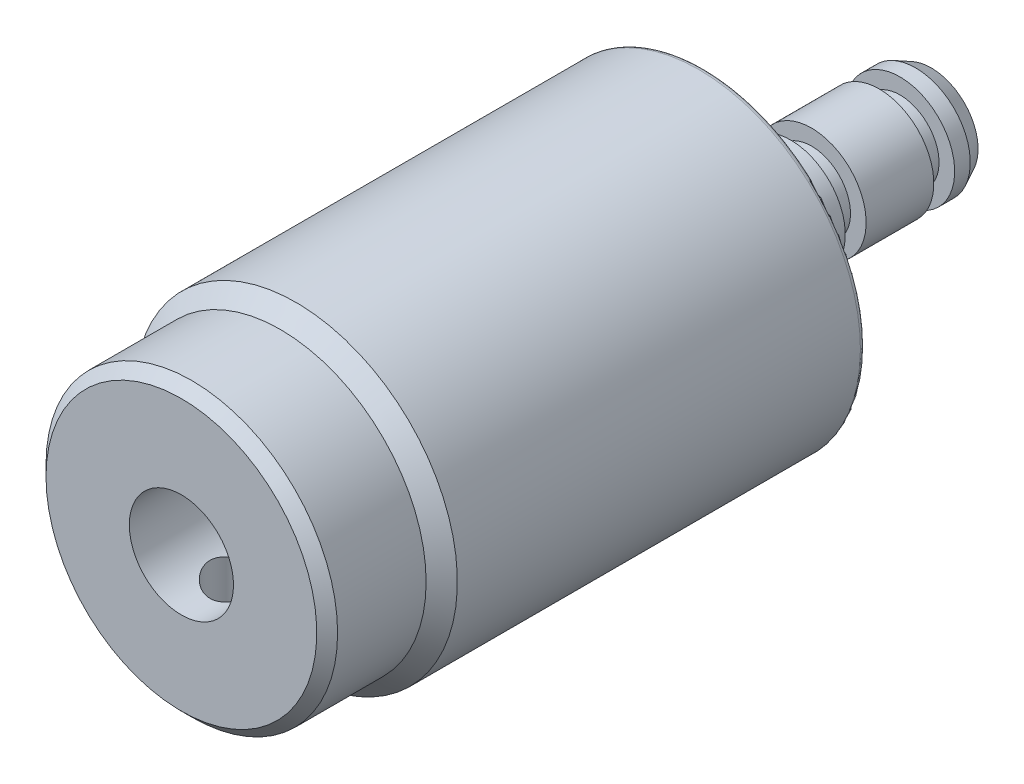
ISO-10303-21;
HEADER;
FILE_DESCRIPTION(('STEP AP214'),'2;1');
FILE_NAME('part.step','',(''),(''),'','','');
FILE_SCHEMA(('AUTOMOTIVE_DESIGN { 1 0 10303 214 1 1 1 1 }'));
ENDSEC;
DATA;
#1=APPLICATION_CONTEXT('core data for automotive mechanical design processes');
#2=APPLICATION_PROTOCOL_DEFINITION('international standard','automotive_design',2000,#1);
#3=PRODUCT_CONTEXT('',#1,'mechanical');
#4=PRODUCT('Part','Part','',(#3));
#5=PRODUCT_RELATED_PRODUCT_CATEGORY('part','',(#4));
#6=PRODUCT_DEFINITION_FORMATION('','',#4);
#7=PRODUCT_DEFINITION_CONTEXT('part definition',#1,'design');
#8=PRODUCT_DEFINITION('design','',#6,#7);
#9=PRODUCT_DEFINITION_SHAPE('','',#8);
#10=(LENGTH_UNIT() NAMED_UNIT(*) SI_UNIT(.MILLI.,.METRE.));
#11=(NAMED_UNIT(*) PLANE_ANGLE_UNIT() SI_UNIT($,.RADIAN.));
#12=(NAMED_UNIT(*) SI_UNIT($,.STERADIAN.) SOLID_ANGLE_UNIT());
#13=UNCERTAINTY_MEASURE_WITH_UNIT(LENGTH_MEASURE(1.E-05),#10,'distance_accuracy_value','');
#14=(GEOMETRIC_REPRESENTATION_CONTEXT(3) GLOBAL_UNCERTAINTY_ASSIGNED_CONTEXT((#13)) GLOBAL_UNIT_ASSIGNED_CONTEXT((#10,
#11,#12)) REPRESENTATION_CONTEXT('',''));
#15=CARTESIAN_POINT('',(0.,0.,0.));
#16=DIRECTION('',(0.,0.,1.));
#17=DIRECTION('',(1.,0.,0.));
#18=AXIS2_PLACEMENT_3D('',#15,#16,#17);
#19=CARTESIAN_POINT('',(0.,0.,0.));
#20=DIRECTION('',(0.,0.,-1.));
#21=DIRECTION('',(-1.,0.,0.));
#22=AXIS2_PLACEMENT_3D('',#19,#20,#21);
#23=CYLINDRICAL_SURFACE('',#22,2.62499999999998);
#24=CARTESIAN_POINT('',(0.,0.,6.75));
#25=DIRECTION('',(0.,0.,-1.));
#26=DIRECTION('',(-1.,0.,0.));
#27=AXIS2_PLACEMENT_3D('',#24,#25,#26);
#28=CIRCLE('',#27,2.62499999999998);
#29=CARTESIAN_POINT('',(-2.62499999999998,0.,6.75));
#30=VERTEX_POINT('',#29);
#31=EDGE_CURVE('E68',#30,#30,#28,.T.);
#32=ORIENTED_EDGE('',*,*,#31,.F.);
#33=EDGE_LOOP('',(#32));
#34=FACE_BOUND('',#33,.T.);
#35=CARTESIAN_POINT('',(0.,0.,7.75));
#36=DIRECTION('',(0.,0.,-1.));
#37=DIRECTION('',(-1.,0.,0.));
#38=AXIS2_PLACEMENT_3D('',#35,#36,#37);
#39=CIRCLE('',#38,2.62499999999998);
#40=CARTESIAN_POINT('',(-2.62499999999998,0.,7.75));
#41=VERTEX_POINT('',#40);
#42=EDGE_CURVE('E136',#41,#41,#39,.T.);
#43=ORIENTED_EDGE('',*,*,#42,.T.);
#44=EDGE_LOOP('',(#43));
#45=FACE_BOUND('',#44,.T.);
#46=ADVANCED_FACE('F43',(#34,#45),#23,.T.);
#47=CARTESIAN_POINT('',(2.62499999999998,0.,6.75));
#48=DIRECTION('',(0.,0.,1.));
#49=DIRECTION('',(1.,0.,0.));
#50=AXIS2_PLACEMENT_3D('',#47,#48,#49);
#51=PLANE('',#50);
#52=CARTESIAN_POINT('',(0.,0.,6.75));
#53=DIRECTION('',(0.,0.,-1.));
#54=DIRECTION('',(-1.,0.,0.));
#55=AXIS2_PLACEMENT_3D('',#52,#53,#54);
#56=CIRCLE('',#55,1.875);
#57=CARTESIAN_POINT('',(-1.875,0.,6.75));
#58=VERTEX_POINT('',#57);
#59=EDGE_CURVE('E72',#58,#58,#56,.T.);
#60=ORIENTED_EDGE('',*,*,#59,.F.);
#61=EDGE_LOOP('',(#60));
#62=FACE_BOUND('',#61,.T.);
#63=ORIENTED_EDGE('',*,*,#31,.T.);
#64=EDGE_LOOP('',(#63));
#65=FACE_BOUND('',#64,.T.);
#66=ADVANCED_FACE('F188',(#62,#65),#51,.F.);
#67=CARTESIAN_POINT('',(0.,0.,0.));
#68=DIRECTION('',(0.,0.,-1.));
#69=DIRECTION('',(-1.,0.,0.));
#70=AXIS2_PLACEMENT_3D('',#67,#68,#69);
#71=CYLINDRICAL_SURFACE('',#70,1.875);
#72=CARTESIAN_POINT('',(0.,0.,5.75));
#73=DIRECTION('',(0.,0.,-1.));
#74=DIRECTION('',(-1.,0.,0.));
#75=AXIS2_PLACEMENT_3D('',#72,#73,#74);
#76=CIRCLE('',#75,1.875);
#77=CARTESIAN_POINT('',(-1.875,0.,5.75));
#78=VERTEX_POINT('',#77);
#79=EDGE_CURVE('E76',#78,#78,#76,.T.);
#80=ORIENTED_EDGE('',*,*,#79,.F.);
#81=EDGE_LOOP('',(#80));
#82=FACE_BOUND('',#81,.T.);
#83=ORIENTED_EDGE('',*,*,#59,.T.);
#84=EDGE_LOOP('',(#83));
#85=FACE_BOUND('',#84,.T.);
#86=ADVANCED_FACE('F194',(#82,#85),#71,.T.);
#87=CARTESIAN_POINT('',(1.875,0.,5.75));
#88=DIRECTION('',(0.,0.,-1.));
#89=DIRECTION('',(-1.,0.,0.));
#90=AXIS2_PLACEMENT_3D('',#87,#88,#89);
#91=PLANE('',#90);
#92=CARTESIAN_POINT('',(0.,0.,5.75));
#93=DIRECTION('',(0.,0.,-1.));
#94=DIRECTION('',(-1.,0.,0.));
#95=AXIS2_PLACEMENT_3D('',#92,#93,#94);
#96=CIRCLE('',#95,2.625);
#97=CARTESIAN_POINT('',(-2.625,0.,5.75));
#98=VERTEX_POINT('',#97);
#99=EDGE_CURVE('E80',#98,#98,#96,.T.);
#100=ORIENTED_EDGE('',*,*,#99,.F.);
#101=EDGE_LOOP('',(#100));
#102=FACE_BOUND('',#101,.T.);
#103=ORIENTED_EDGE('',*,*,#79,.T.);
#104=EDGE_LOOP('',(#103));
#105=FACE_BOUND('',#104,.T.);
#106=ADVANCED_FACE('F312',(#102,#105),#91,.F.);
#107=CARTESIAN_POINT('',(0.,0.,0.));
#108=DIRECTION('',(0.,0.,-1.));
#109=DIRECTION('',(-1.,0.,0.));
#110=AXIS2_PLACEMENT_3D('',#107,#108,#109);
#111=CYLINDRICAL_SURFACE('',#110,2.625);
#112=CARTESIAN_POINT('',(0.,0.,2.5));
#113=DIRECTION('',(0.,0.,-1.));
#114=DIRECTION('',(-1.,0.,0.));
#115=AXIS2_PLACEMENT_3D('',#112,#113,#114);
#116=CIRCLE('',#115,2.625);
#117=CARTESIAN_POINT('',(-2.625,0.,2.5));
#118=VERTEX_POINT('',#117);
#119=EDGE_CURVE('E84',#118,#118,#116,.T.);
#120=ORIENTED_EDGE('',*,*,#119,.F.);
#121=EDGE_LOOP('',(#120));
#122=FACE_BOUND('',#121,.T.);
#123=ORIENTED_EDGE('',*,*,#99,.T.);
#124=EDGE_LOOP('',(#123));
#125=FACE_BOUND('',#124,.T.);
#126=ADVANCED_FACE('F304',(#122,#125),#111,.T.);
#127=CARTESIAN_POINT('',(2.625,0.,2.5));
#128=DIRECTION('',(0.,0.,1.));
#129=DIRECTION('',(1.,0.,0.));
#130=AXIS2_PLACEMENT_3D('',#127,#128,#129);
#131=PLANE('',#130);
#132=CARTESIAN_POINT('',(0.,0.,2.5));
#133=DIRECTION('',(0.,0.,-1.));
#134=DIRECTION('',(-1.,0.,0.));
#135=AXIS2_PLACEMENT_3D('',#132,#133,#134);
#136=CIRCLE('',#135,1.875);
#137=CARTESIAN_POINT('',(-1.875,0.,2.5));
#138=VERTEX_POINT('',#137);
#139=EDGE_CURVE('E88',#138,#138,#136,.T.);
#140=ORIENTED_EDGE('',*,*,#139,.F.);
#141=EDGE_LOOP('',(#140));
#142=FACE_BOUND('',#141,.T.);
#143=ORIENTED_EDGE('',*,*,#119,.T.);
#144=EDGE_LOOP('',(#143));
#145=FACE_BOUND('',#144,.T.);
#146=ADVANCED_FACE('F296',(#142,#145),#131,.F.);
#147=CARTESIAN_POINT('',(0.,0.,0.));
#148=DIRECTION('',(0.,0.,-1.));
#149=DIRECTION('',(-1.,0.,0.));
#150=AXIS2_PLACEMENT_3D('',#147,#148,#149);
#151=CYLINDRICAL_SURFACE('',#150,1.875);
#152=CARTESIAN_POINT('',(0.,0.,1.5));
#153=DIRECTION('',(0.,0.,-1.));
#154=DIRECTION('',(-1.,0.,0.));
#155=AXIS2_PLACEMENT_3D('',#152,#153,#154);
#156=CIRCLE('',#155,1.875);
#157=CARTESIAN_POINT('',(-1.875,0.,1.5));
#158=VERTEX_POINT('',#157);
#159=EDGE_CURVE('E92',#158,#158,#156,.T.);
#160=ORIENTED_EDGE('',*,*,#159,.F.);
#161=EDGE_LOOP('',(#160));
#162=FACE_BOUND('',#161,.T.);
#163=ORIENTED_EDGE('',*,*,#139,.T.);
#164=EDGE_LOOP('',(#163));
#165=FACE_BOUND('',#164,.T.);
#166=ADVANCED_FACE('F288',(#162,#165),#151,.T.);
#167=CARTESIAN_POINT('',(1.875,0.,1.5));
#168=DIRECTION('',(0.,0.,-1.));
#169=DIRECTION('',(-1.,0.,0.));
#170=AXIS2_PLACEMENT_3D('',#167,#168,#169);
#171=PLANE('',#170);
#172=CARTESIAN_POINT('',(0.,0.,1.5));
#173=DIRECTION('',(0.,0.,-1.));
#174=DIRECTION('',(-1.,0.,0.));
#175=AXIS2_PLACEMENT_3D('',#172,#173,#174);
#176=CIRCLE('',#175,2.625);
#177=CARTESIAN_POINT('',(-2.625,0.,1.5));
#178=VERTEX_POINT('',#177);
#179=EDGE_CURVE('E96',#178,#178,#176,.T.);
#180=ORIENTED_EDGE('',*,*,#179,.F.);
#181=EDGE_LOOP('',(#180));
#182=FACE_BOUND('',#181,.T.);
#183=ORIENTED_EDGE('',*,*,#159,.T.);
#184=EDGE_LOOP('',(#183));
#185=FACE_BOUND('',#184,.T.);
#186=ADVANCED_FACE('F280',(#182,#185),#171,.F.);
#187=CARTESIAN_POINT('',(0.,0.,0.));
#188=DIRECTION('',(0.,0.,-1.));
#189=DIRECTION('',(-1.,0.,0.));
#190=AXIS2_PLACEMENT_3D('',#187,#188,#189);
#191=CYLINDRICAL_SURFACE('',#190,2.625);
#192=CARTESIAN_POINT('',(0.,0.,0.75));
#193=DIRECTION('',(0.,0.,-1.));
#194=DIRECTION('',(-1.,0.,0.));
#195=AXIS2_PLACEMENT_3D('',#192,#193,#194);
#196=CIRCLE('',#195,2.625);
#197=CARTESIAN_POINT('',(-2.625,0.,0.75));
#198=VERTEX_POINT('',#197);
#199=EDGE_CURVE('E100',#198,#198,#196,.T.);
#200=ORIENTED_EDGE('',*,*,#199,.F.);
#201=EDGE_LOOP('',(#200));
#202=FACE_BOUND('',#201,.T.);
#203=ORIENTED_EDGE('',*,*,#179,.T.);
#204=EDGE_LOOP('',(#203));
#205=FACE_BOUND('',#204,.T.);
#206=ADVANCED_FACE('F272',(#202,#205),#191,.T.);
#207=CARTESIAN_POINT('',(0.,0.,0.75));
#208=DIRECTION('',(0.,0.,1.));
#209=DIRECTION('',(1.,0.,0.));
#210=AXIS2_PLACEMENT_3D('',#207,#208,#209);
#211=CONICAL_SURFACE('',#210,2.625,0.463647609000807);
#212=CARTESIAN_POINT('',(0.,0.,0.));
#213=DIRECTION('',(0.,0.,-1.));
#214=DIRECTION('',(-1.,0.,0.));
#215=AXIS2_PLACEMENT_3D('',#212,#213,#214);
#216=CIRCLE('',#215,2.25);
#217=CARTESIAN_POINT('',(-2.25,0.,0.));
#218=VERTEX_POINT('',#217);
#219=EDGE_CURVE('E104',#218,#218,#216,.T.);
#220=ORIENTED_EDGE('',*,*,#219,.F.);
#221=EDGE_LOOP('',(#220));
#222=FACE_BOUND('',#221,.T.);
#223=ORIENTED_EDGE('',*,*,#199,.T.);
#224=EDGE_LOOP('',(#223));
#225=FACE_BOUND('',#224,.T.);
#226=ADVANCED_FACE('F264',(#222,#225),#211,.T.);
#227=CARTESIAN_POINT('',(2.25,0.,0.));
#228=DIRECTION('',(0.,0.,1.));
#229=DIRECTION('',(1.,0.,0.));
#230=AXIS2_PLACEMENT_3D('',#227,#228,#229);
#231=PLANE('',#230);
#232=CARTESIAN_POINT('',(0.,0.,0.));
#233=DIRECTION('',(0.,0.,-1.));
#234=DIRECTION('',(-1.,0.,0.));
#235=AXIS2_PLACEMENT_3D('',#232,#233,#234);
#236=CIRCLE('',#235,1.5);
#237=CARTESIAN_POINT('',(-1.5,0.,0.));
#238=VERTEX_POINT('',#237);
#239=EDGE_CURVE('E108',#238,#238,#236,.T.);
#240=ORIENTED_EDGE('',*,*,#239,.F.);
#241=EDGE_LOOP('',(#240));
#242=FACE_BOUND('',#241,.T.);
#243=ORIENTED_EDGE('',*,*,#219,.T.);
#244=EDGE_LOOP('',(#243));
#245=FACE_BOUND('',#244,.T.);
#246=ADVANCED_FACE('F256',(#242,#245),#231,.F.);
#247=CARTESIAN_POINT('',(0.,0.,0.));
#248=DIRECTION('',(0.,0.,-1.));
#249=DIRECTION('',(-1.,0.,0.));
#250=AXIS2_PLACEMENT_3D('',#247,#248,#249);
#251=CYLINDRICAL_SURFACE('',#250,1.50000000000001);
#252=CARTESIAN_POINT('',(0.,0.,30.4226497308104));
#253=DIRECTION('',(0.,0.,-1.));
#254=DIRECTION('',(-1.,0.,0.));
#255=AXIS2_PLACEMENT_3D('',#252,#253,#254);
#256=CIRCLE('',#255,1.50000000000002);
#257=CARTESIAN_POINT('',(-1.50000000000001,0.,30.4226497308104));
#258=VERTEX_POINT('',#257);
#259=EDGE_CURVE('E112',#258,#258,#256,.T.);
#260=ORIENTED_EDGE('',*,*,#259,.F.);
#261=EDGE_LOOP('',(#260));
#262=FACE_BOUND('',#261,.T.);
#263=ORIENTED_EDGE('',*,*,#239,.T.);
#264=EDGE_LOOP('',(#263));
#265=FACE_BOUND('',#264,.T.);
#266=ADVANCED_FACE('F248',(#262,#265),#251,.F.);
#267=CARTESIAN_POINT('',(0.,0.,30.4226497308104));
#268=DIRECTION('',(0.,0.,1.));
#269=DIRECTION('',(1.,0.,0.));
#270=AXIS2_PLACEMENT_3D('',#267,#268,#269);
#271=CONICAL_SURFACE('',#270,1.50000000000002,1.0471975511966);
#272=CARTESIAN_POINT('',(0.,0.,31.));
#273=DIRECTION('',(0.,0.,-1.));
#274=DIRECTION('',(-1.,0.,0.));
#275=AXIS2_PLACEMENT_3D('',#272,#273,#274);
#276=CIRCLE('',#275,2.5);
#277=CARTESIAN_POINT('',(-2.49999999999999,0.,31.));
#278=VERTEX_POINT('',#277);
#279=EDGE_CURVE('E116',#278,#278,#276,.T.);
#280=ORIENTED_EDGE('',*,*,#279,.F.);
#281=EDGE_LOOP('',(#280));
#282=FACE_BOUND('',#281,.T.);
#283=ORIENTED_EDGE('',*,*,#259,.T.);
#284=EDGE_LOOP('',(#283));
#285=FACE_BOUND('',#284,.T.);
#286=ADVANCED_FACE('F240',(#282,#285),#271,.F.);
#287=CARTESIAN_POINT('',(0.,0.,0.));
#288=DIRECTION('',(0.,0.,-1.));
#289=DIRECTION('',(-1.,0.,0.));
#290=AXIS2_PLACEMENT_3D('',#287,#288,#289);
#291=CYLINDRICAL_SURFACE('',#290,2.5);
#292=CARTESIAN_POINT('',(0.,-2.5,32.125));
#293=CARTESIAN_POINT('',(0.0657149536912367,-2.49999641755188,32.1250041278994));
#294=CARTESIAN_POINT('',(0.131508249622544,-2.49738113774397,32.1302125914021));
#295=CARTESIAN_POINT('',(0.261150294085534,-2.48717695046745,32.1508161004261));
#296=CARTESIAN_POINT('',(0.324995108391882,-2.47957859786229,32.1662304912471));
#297=CARTESIAN_POINT('',(0.448666931100718,-2.46020349254139,32.206492260771));
#298=CARTESIAN_POINT('',(0.508508503673972,-2.448442989719,32.23130298031));
#299=CARTESIAN_POINT('',(0.623090771008202,-2.42182220644723,32.2894632767062));
#300=CARTESIAN_POINT('',(0.677831867487559,-2.40696217041913,32.3228121803111));
#301=CARTESIAN_POINT('',(0.784384772202398,-2.37445322822571,32.3993965618566));
#302=CARTESIAN_POINT('',(0.83581901390264,-2.3566899890942,32.4431080990495));
#303=CARTESIAN_POINT('',(0.930974306083721,-2.3207496280843,32.5381518490588));
#304=CARTESIAN_POINT('',(0.974689478883456,-2.30257220261294,32.5894898147155));
#305=CARTESIAN_POINT('',(1.05656500056285,-2.26623688996684,32.7031041869042));
#306=CARTESIAN_POINT('',(1.09403166943954,-2.24818983712665,32.7659201229324));
#307=CARTESIAN_POINT('',(1.15771028361337,-2.21607473465401,32.8979591699828));
#308=CARTESIAN_POINT('',(1.18393026870792,-2.20200384508737,32.9671776609034));
#309=CARTESIAN_POINT('',(1.22266555273573,-2.18072333797261,33.1058313817774));
#310=CARTESIAN_POINT('',(1.23590732135055,-2.17315339479642,33.1750055650842));
#311=CARTESIAN_POINT('',(1.25053374163605,-2.1647736243566,33.3149735472243));
#312=CARTESIAN_POINT('',(1.25193011046634,-2.1639571167911,33.3857656760889));
#313=CARTESIAN_POINT('',(1.24335910896536,-2.16888662821561,33.5178575303942));
#314=CARTESIAN_POINT('',(1.23473069942102,-2.17385954577517,33.5792800390288));
#315=CARTESIAN_POINT('',(1.20867481132116,-2.18845285917313,33.6996523867163));
#316=CARTESIAN_POINT('',(1.19124452987206,-2.1980747353972,33.7586014316316));
#317=CARTESIAN_POINT('',(1.1477622254825,-2.22109345515926,33.8740364157071));
#318=CARTESIAN_POINT('',(1.12151883389499,-2.23457300829998,33.9304329984822));
#319=CARTESIAN_POINT('',(1.061302109585,-2.26379255351755,34.0382928657375));
#320=CARTESIAN_POINT('',(1.02732530476558,-2.27953355975238,34.0897539195001));
#321=CARTESIAN_POINT('',(0.947582568640982,-2.31391447379107,34.193151565929));
#322=CARTESIAN_POINT('',(0.900868072961599,-2.33266887795933,34.2443210919702));
#323=CARTESIAN_POINT('',(0.799444473426716,-2.36934529125509,34.3384192732386));
#324=CARTESIAN_POINT('',(0.744731570717857,-2.38726689948501,34.3813439900423));
#325=CARTESIAN_POINT('',(0.625645632289814,-2.42127484103705,34.4596070762871));
#326=CARTESIAN_POINT('',(0.560941989499266,-2.43723730202509,34.4945005905572));
#327=CARTESIAN_POINT('',(0.425582769361,-2.46447351401553,34.5526212863037));
#328=CARTESIAN_POINT('',(0.354931970331598,-2.47575098679441,34.5758577312689));
#329=CARTESIAN_POINT('',(0.215958114575878,-2.49155417176795,34.6080942546458));
#330=CARTESIAN_POINT('',(0.147926913185406,-2.49656172876639,34.6181140446835));
#331=CARTESIAN_POINT('',(0.0109744999366943,-2.50091266823877,34.6268309139181));
#332=CARTESIAN_POINT('',(-0.0579462748373739,-2.5002587340164,34.6255333570493));
#333=CARTESIAN_POINT('',(-0.189041214982488,-2.49363990316801,34.6122416394765));
#334=CARTESIAN_POINT('',(-0.251324260062439,-2.48809057110237,34.6010843340874));
#335=CARTESIAN_POINT('',(-0.373008615377391,-2.47277714143524,34.5697024101311));
#336=CARTESIAN_POINT('',(-0.432409607113741,-2.46301257917915,34.5494767919333));
#337=CARTESIAN_POINT('',(-0.548610760562077,-2.43980314267087,34.5000019169585));
#338=CARTESIAN_POINT('',(-0.605287996257687,-2.42626102212424,34.470511187354));
#339=CARTESIAN_POINT('',(-0.713076702123645,-2.39679967896386,34.4036155804424));
#340=CARTESIAN_POINT('',(-0.764185787219097,-2.38087944457231,34.3662073317582));
#341=CARTESIAN_POINT('',(-0.864709611613312,-2.3463527667183,34.2802994683339));
#342=CARTESIAN_POINT('',(-0.913465097280794,-2.32763606060551,34.231071414433));
#343=CARTESIAN_POINT('',(-1.00232040139154,-2.29077989504843,34.1250935609133));
#344=CARTESIAN_POINT('',(-1.04241423211354,-2.27264084226908,34.0683386014795));
#345=CARTESIAN_POINT('',(-1.11463489312211,-2.23813990282585,33.9454454322496));
#346=CARTESIAN_POINT('',(-1.14628186984829,-2.2219066207934,33.8789859172392));
#347=CARTESIAN_POINT('',(-1.19760353251724,-2.19467590460158,33.7406124153843));
#348=CARTESIAN_POINT('',(-1.21729364485945,-2.18367172800773,33.6687055918735));
#349=CARTESIAN_POINT('',(-1.24232710931209,-2.16951876260834,33.5288622214232));
#350=CARTESIAN_POINT('',(-1.24886624550107,-2.16571729325614,33.4612071832137));
#351=CARTESIAN_POINT('',(-1.25086144297597,-2.16456693307719,33.3256911660366));
#352=CARTESIAN_POINT('',(-1.24632230828049,-2.16721524534441,33.2578302890757));
#353=CARTESIAN_POINT('',(-1.22740765699032,-2.17797327562531,33.130645623085));
#354=CARTESIAN_POINT('',(-1.21401039292849,-2.18553868102992,33.0711244123195));
#355=CARTESIAN_POINT('',(-1.17896919778079,-2.20463770234897,32.9552398507191));
#356=CARTESIAN_POINT('',(-1.15732261394975,-2.21617259462095,32.898877522385));
#357=CARTESIAN_POINT('',(-1.10476968162584,-2.2428566295566,32.7867189362667));
#358=CARTESIAN_POINT('',(-1.07333892227056,-2.25819652995239,32.7312151227129));
#359=CARTESIAN_POINT('',(-1.00268871454578,-2.29044164543238,32.6259068297743));
#360=CARTESIAN_POINT('',(-0.963465214048296,-2.30734767243153,32.5761053368519));
#361=CARTESIAN_POINT('',(-0.872754158330787,-2.34327903949141,32.477322522053));
#362=CARTESIAN_POINT('',(-0.820355528762701,-2.36231229139336,32.4291761220476));
#363=CARTESIAN_POINT('',(-0.707693507775337,-2.3984719031886,32.3421712707204));
#364=CARTESIAN_POINT('',(-0.647425904070968,-2.4155972326005,32.3033178257171));
#365=CARTESIAN_POINT('',(-0.51991449602492,-2.44622511981379,32.2359545465472));
#366=CARTESIAN_POINT('',(-0.452624379918255,-2.45970120703636,32.2075197882357));
#367=CARTESIAN_POINT('',(-0.313427626617728,-2.48126676704332,32.1627397901013));
#368=CARTESIAN_POINT('',(-0.241534749528947,-2.48937154216165,32.146360191463));
#369=CARTESIAN_POINT('',(-0.140752433104221,-2.49619327387079,32.1326282361552));
#370=CARTESIAN_POINT('',(-0.112702349299365,-2.49761706674002,32.1297716989205));
#371=CARTESIAN_POINT('',(-0.0564396647589412,-2.49952121222331,32.125956668104));
#372=CARTESIAN_POINT('',(-0.0282270595592218,-2.50000153879704,32.124998226911));
#373=CARTESIAN_POINT('',(0.,-2.5,32.125));
#374=B_SPLINE_CURVE_WITH_KNOTS('',3,(#292,#293,#294,#295,#296,#297,#298,#299,#300,#301,#302,
#303,#304,#305,#306,#307,#308,#309,#310,#311,#312,#313,#314,#315,#316,#317,#318,#319,#320,#321,
#322,#323,#324,#325,#326,#327,#328,#329,#330,#331,#332,#333,#334,#335,#336,#337,#338,#339,#340,
#341,#342,#343,#344,#345,#346,#347,#348,#349,#350,#351,#352,#353,#354,#355,#356,#357,#358,#359,
#360,#361,#362,#363,#364,#365,#366,#367,#368,#369,#370,#371,#372,#373),.UNSPECIFIED.,.T.,.F.,(4,
2,2,2,2,2,2,2,2,2,2,2,2,2,2,2,2,2,2,2,2,2,2,2,2,2,2,2,2,2,2,2,2,2,2,2,2,2,2,2,4),(0.,
0.197030321775364,0.394435187136494,0.591077694365364,0.787704700726954,0.996227198397604,
1.20490779706754,1.4297715803844,1.65447434872851,1.86572515175286,2.07676696661275,
2.2625714051165,2.44843504907096,2.63862800210608,2.82890651575276,3.04331176667347,
3.25781918248355,3.48228777768048,3.70657771140348,3.9122911308918,4.11790705639343,
4.3075863313265,4.49728652038662,4.69241070034871,4.88761813435421,5.10199513305521,
5.31651985769287,5.54143352699589,5.76605639925969,5.96911634372964,6.17208824825004,
6.35572412805225,6.53941910979594,6.73545570969515,6.93159451423694,7.15156553440619,
7.37165479220712,7.59330017078652,7.81431135781159,7.89894100172118,7.98357298143554),.UNSPECIFIED.);
#375=CARTESIAN_POINT('',(0.,-2.5,32.125));
#376=VERTEX_POINT('',#375);
#377=EDGE_CURVE('E149',#376,#376,#374,.T.);
#378=ORIENTED_EDGE('',*,*,#377,.T.);
#379=EDGE_LOOP('',(#378));
#380=FACE_BOUND('',#379,.T.);
#381=CARTESIAN_POINT('',(0.,0.,36.));
#382=DIRECTION('',(0.,0.,-1.));
#383=DIRECTION('',(-1.,0.,0.));
#384=AXIS2_PLACEMENT_3D('',#381,#382,#383);
#385=CIRCLE('',#384,2.5);
#386=CARTESIAN_POINT('',(-2.5,0.,36.));
#387=VERTEX_POINT('',#386);
#388=EDGE_CURVE('E120',#387,#387,#385,.T.);
#389=ORIENTED_EDGE('',*,*,#388,.F.);
#390=EDGE_LOOP('',(#389));
#391=FACE_BOUND('',#390,.T.);
#392=ORIENTED_EDGE('',*,*,#279,.T.);
#393=EDGE_LOOP('',(#392));
#394=FACE_BOUND('',#393,.T.);
#395=ADVANCED_FACE('F235',(#380,#391,#394),#291,.F.);
#396=CARTESIAN_POINT('',(2.5,0.,36.));
#397=DIRECTION('',(0.,0.,-1.));
#398=DIRECTION('',(-1.,0.,0.));
#399=AXIS2_PLACEMENT_3D('',#396,#397,#398);
#400=PLANE('',#399);
#401=CARTESIAN_POINT('',(0.,0.,36.));
#402=DIRECTION('',(0.,0.,-1.));
#403=DIRECTION('',(-1.,0.,0.));
#404=AXIS2_PLACEMENT_3D('',#401,#402,#403);
#405=CIRCLE('',#404,6.5);
#406=CARTESIAN_POINT('',(-6.49999999999999,0.,36.));
#407=VERTEX_POINT('',#406);
#408=EDGE_CURVE('E10',#407,#407,#405,.F.);
#409=ORIENTED_EDGE('',*,*,#408,.T.);
#410=EDGE_LOOP('',(#409));
#411=FACE_BOUND('',#410,.T.);
#412=ORIENTED_EDGE('',*,*,#388,.T.);
#413=EDGE_LOOP('',(#412));
#414=FACE_BOUND('',#413,.T.);
#415=ADVANCED_FACE('F183',(#411,#414),#400,.F.);
#416=CARTESIAN_POINT('',(0.,0.,0.));
#417=DIRECTION('',(0.,0.,-1.));
#418=DIRECTION('',(-1.,0.,0.));
#419=AXIS2_PLACEMENT_3D('',#416,#417,#418);
#420=CYLINDRICAL_SURFACE('',#419,7.);
#421=CARTESIAN_POINT('',(0.,-7.,32.125));
#422=CARTESIAN_POINT('',(-0.0696197924423416,-6.99999876397597,32.1250027213011));
#423=CARTESIAN_POINT('',(-0.139275699399378,-6.99895060928587,32.1308359512252));
#424=CARTESIAN_POINT('',(-0.276628730775719,-6.99487029587918,32.1540020831911));
#425=CARTESIAN_POINT('',(-0.344324082054927,-6.9918363963652,32.1713450754189));
#426=CARTESIAN_POINT('',(-0.475749358001665,-6.98412437753366,32.216986116619));
#427=CARTESIAN_POINT('',(-0.539482660117302,-6.97944768188137,32.2452746821842));
#428=CARTESIAN_POINT('',(-0.661291471994215,-6.96896231649392,32.3119778441085));
#429=CARTESIAN_POINT('',(-0.719367522091869,-6.96315375502504,32.3503914720997));
#430=CARTESIAN_POINT('',(-0.828853721624168,-6.95097616233974,32.4366996065088));
#431=CARTESIAN_POINT('',(-0.88019321015348,-6.94460221026335,32.4846830649354));
#432=CARTESIAN_POINT('',(-0.974138056636671,-6.93204924305886,32.5885773747687));
#433=CARTESIAN_POINT('',(-1.01674282190198,-6.92587024118302,32.6444887636844));
#434=CARTESIAN_POINT('',(-1.09229802264273,-6.91435905121301,32.7631450585567));
#435=CARTESIAN_POINT('',(-1.12517745968518,-6.90903321476433,32.825935843462));
#436=CARTESIAN_POINT('',(-1.17989439084461,-6.89990026216799,32.9562605793322));
#437=CARTESIAN_POINT('',(-1.20173274507261,-6.89609302772464,33.0237941603619));
#438=CARTESIAN_POINT('',(-1.23352263528582,-6.89047765557561,33.1609344107074));
#439=CARTESIAN_POINT('',(-1.24359686781954,-6.88864889795947,33.2305117775708));
#440=CARTESIAN_POINT('',(-1.25195320297836,-6.88713528511934,33.3703914610036));
#441=CARTESIAN_POINT('',(-1.25023626389774,-6.88745025566986,33.440693718196));
#442=CARTESIAN_POINT('',(-1.23515868236773,-6.89016971388499,33.5791444487183));
#443=CARTESIAN_POINT('',(-1.22193680797516,-6.8925492980011,33.6473085951271));
#444=CARTESIAN_POINT('',(-1.18444287693054,-6.89909080824472,33.7804353182493));
#445=CARTESIAN_POINT('',(-1.16017039053014,-6.90325280368823,33.8453977703427));
#446=CARTESIAN_POINT('',(-1.10112633898189,-6.9129166031172,33.9706872394346));
#447=CARTESIAN_POINT('',(-1.0662980393802,-6.91842561521352,34.0309869408044));
#448=CARTESIAN_POINT('',(-0.987171201031494,-6.93015785316704,34.1449387511077));
#449=CARTESIAN_POINT('',(-0.942871787902335,-6.93638114494264,34.1985902455496));
#450=CARTESIAN_POINT('',(-0.845308544532924,-6.94894965501386,34.2985251088937));
#451=CARTESIAN_POINT('',(-0.791925855758296,-6.95529534624387,34.3446924589898));
#452=CARTESIAN_POINT('',(-0.67811100070137,-6.96731186800251,34.427433066454));
#453=CARTESIAN_POINT('',(-0.617678775645569,-6.97298269290384,34.4640062438251));
#454=CARTESIAN_POINT('',(-0.491364562705136,-6.98302041929516,34.5265345118481));
#455=CARTESIAN_POINT('',(-0.425476883346244,-6.98738593655032,34.5524783411489));
#456=CARTESIAN_POINT('',(-0.290183700517964,-6.99431030998523,34.592898441096));
#457=CARTESIAN_POINT('',(-0.220778536182405,-6.99686933998133,34.6073758150364));
#458=CARTESIAN_POINT('',(-0.0814194926908513,-6.9998687531765,34.6242924230225));
#459=CARTESIAN_POINT('',(-0.0114855085287124,-7.00033713461244,34.626890754274));
#460=CARTESIAN_POINT('',(0.127817981130512,-6.99917952689596,34.6204011301183));
#461=CARTESIAN_POINT('',(0.197187511548232,-6.99755363071634,34.611313693486));
#462=CARTESIAN_POINT('',(0.33289415494002,-6.99240754172808,34.5818428007548));
#463=CARTESIAN_POINT('',(0.399249135096587,-6.98890072530254,34.5615390803911));
#464=CARTESIAN_POINT('',(0.527613333347351,-6.98038436613849,34.5102976849073));
#465=CARTESIAN_POINT('',(0.589622278004154,-6.97537472895227,34.4793593414156));
#466=CARTESIAN_POINT('',(0.708218549757098,-6.96433866934137,34.4073693885438));
#467=CARTESIAN_POINT('',(0.764745364265276,-6.95830256688857,34.3662196042301));
#468=CARTESIAN_POINT('',(0.870148314945128,-6.94590984015708,34.2751086744692));
#469=CARTESIAN_POINT('',(0.919023806795198,-6.93955318894436,34.2251467877033));
#470=CARTESIAN_POINT('',(1.00833474628658,-6.92714394562996,34.1171125153762));
#471=CARTESIAN_POINT('',(1.04866208560834,-6.92109590760897,34.0589501495664));
#472=CARTESIAN_POINT('',(1.11897413538699,-6.91007733322136,33.9365831552756));
#473=CARTESIAN_POINT('',(1.14895920685206,-6.90510675924693,33.8723787377986));
#474=CARTESIAN_POINT('',(1.19757853098713,-6.89684095181923,33.7400369125796));
#475=CARTESIAN_POINT('',(1.21626421462317,-6.89353813880083,33.6719188945909));
#476=CARTESIAN_POINT('',(1.24191447945726,-6.88896372120458,33.5334463524269));
#477=CARTESIAN_POINT('',(1.24888024712932,-6.88769191101738,33.4630920553776));
#478=CARTESIAN_POINT('',(1.25085614890263,-6.88733324217078,33.3232253955493));
#479=CARTESIAN_POINT('',(1.24603664017667,-6.88821524963872,33.2537154614291));
#480=CARTESIAN_POINT('',(1.22494973121549,-6.89199615523606,33.116513090991));
#481=CARTESIAN_POINT('',(1.20868238480685,-6.89489504388228,33.0488206461289));
#482=CARTESIAN_POINT('',(1.16523056932675,-6.90237052940211,32.9172550619833));
#483=CARTESIAN_POINT('',(1.13806288257358,-6.9069445462846,32.853376224107));
#484=CARTESIAN_POINT('',(1.07359967028368,-6.91725701322019,32.7310557802816));
#485=CARTESIAN_POINT('',(1.03630352227253,-6.92299553483587,32.6726145088108));
#486=CARTESIAN_POINT('',(0.952042837143917,-6.93508798882304,32.561971476305));
#487=CARTESIAN_POINT('',(0.904953705777516,-6.94144922951402,32.5098653841284));
#488=CARTESIAN_POINT('',(0.802704998630159,-6.95401412176594,32.4142370970169));
#489=CARTESIAN_POINT('',(0.747543569019638,-6.9602177367425,32.3707168792614));
#490=CARTESIAN_POINT('',(0.630185373301318,-6.9718267339403,32.2931711161056));
#491=CARTESIAN_POINT('',(0.567935518835292,-6.97722528421424,32.2592248703042));
#492=CARTESIAN_POINT('',(0.438542420095241,-6.98654935562555,32.2023253983536));
#493=CARTESIAN_POINT('',(0.371403967978273,-6.99047629672906,32.1793615692512));
#494=CARTESIAN_POINT('',(0.253365877745877,-6.99558898678742,32.149884693302));
#495=CARTESIAN_POINT('',(0.203167433835838,-6.99723399859315,32.1405684315316));
#496=CARTESIAN_POINT('',(0.101985776019473,-6.99943994626216,32.1281251547981));
#497=CARTESIAN_POINT('',(0.0510025790548343,-7.00000090549557,32.1249980064093));
#498=CARTESIAN_POINT('',(0.,-7.,32.125));
#499=B_SPLINE_CURVE_WITH_KNOTS('',3,(#421,#422,#423,#424,#425,#426,#427,#428,#429,#430,#431,
#432,#433,#434,#435,#436,#437,#438,#439,#440,#441,#442,#443,#444,#445,#446,#447,#448,#449,#450,
#451,#452,#453,#454,#455,#456,#457,#458,#459,#460,#461,#462,#463,#464,#465,#466,#467,#468,#469,
#470,#471,#472,#473,#474,#475,#476,#477,#478,#479,#480,#481,#482,#483,#484,#485,#486,#487,#488,
#489,#490,#491,#492,#493,#494,#495,#496,#497,#498),.UNSPECIFIED.,.T.,.F.,(4,2,2,2,2,2,2,2,2,2,2,
2,2,2,2,2,2,2,2,2,2,2,2,2,2,2,2,2,2,2,2,2,2,2,2,2,2,2,4),(0.,0.208672898370813,0.41752897468701,
0.626204498745017,0.834860072169507,1.04555398394512,1.25626218748139,1.46847268234667,
1.680666643261,1.89062713379411,2.10057056058127,2.30801629213299,2.51547009175176,
2.7240592869755,2.93266774767274,3.14425188945736,3.35583779539069,3.56764729168082,
3.7794364053344,3.98838053310805,4.19731538539158,4.40478370072619,4.61226505754753,
4.82182420244062,5.03140098492946,5.2434881038894,5.45556781896714,5.66667480743358,
5.87776042304785,6.08581286176571,6.29386432224864,6.5015966854302,6.70934181830649,
6.91991234386759,7.13053130374624,7.34284672270059,7.55495674626046,7.70783116702341,
7.86070229206406),.UNSPECIFIED.);
#500=CARTESIAN_POINT('',(0.,-7.,32.125));
#501=VERTEX_POINT('',#500);
#502=EDGE_CURVE('E140',#501,#501,#499,.T.);
#503=ORIENTED_EDGE('',*,*,#502,.T.);
#504=EDGE_LOOP('',(#503));
#505=FACE_BOUND('',#504,.T.);
#506=CARTESIAN_POINT('',(0.,0.,35.5));
#507=DIRECTION('',(0.,0.,-1.));
#508=DIRECTION('',(-1.,0.,0.));
#509=AXIS2_PLACEMENT_3D('',#506,#507,#508);
#510=CIRCLE('',#509,7.);
#511=CARTESIAN_POINT('',(-6.99999999999999,0.,35.5));
#512=VERTEX_POINT('',#511);
#513=EDGE_CURVE('E52',#512,#512,#510,.T.);
#514=ORIENTED_EDGE('',*,*,#513,.T.);
#515=EDGE_LOOP('',(#514));
#516=FACE_BOUND('',#515,.T.);
#517=CARTESIAN_POINT('',(0.,0.,31.25));
#518=DIRECTION('',(0.,0.,-1.));
#519=DIRECTION('',(-1.,0.,0.));
#520=AXIS2_PLACEMENT_3D('',#517,#518,#519);
#521=CIRCLE('',#520,7.);
#522=CARTESIAN_POINT('',(-6.99999999999999,0.,31.25));
#523=VERTEX_POINT('',#522);
#524=EDGE_CURVE('E124',#523,#523,#521,.T.);
#525=ORIENTED_EDGE('',*,*,#524,.F.);
#526=EDGE_LOOP('',(#525));
#527=FACE_BOUND('',#526,.T.);
#528=ADVANCED_FACE('F154',(#505,#516,#527),#420,.T.);
#529=CARTESIAN_POINT('',(0.,0.,31.25));
#530=DIRECTION('',(0.,0.,-1.));
#531=DIRECTION('',(-1.,0.,0.));
#532=AXIS2_PLACEMENT_3D('',#529,#530,#531);
#533=CONICAL_SURFACE('',#532,7.,0.78539816339745);
#534=CARTESIAN_POINT('',(0.,0.,30.5));
#535=DIRECTION('',(0.,0.,-1.));
#536=DIRECTION('',(-1.,0.,0.));
#537=AXIS2_PLACEMENT_3D('',#534,#535,#536);
#538=CIRCLE('',#537,7.75);
#539=CARTESIAN_POINT('',(-7.75,0.,30.5));
#540=VERTEX_POINT('',#539);
#541=EDGE_CURVE('E128',#540,#540,#538,.T.);
#542=ORIENTED_EDGE('',*,*,#541,.F.);
#543=EDGE_LOOP('',(#542));
#544=FACE_BOUND('',#543,.T.);
#545=ORIENTED_EDGE('',*,*,#524,.T.);
#546=EDGE_LOOP('',(#545));
#547=FACE_BOUND('',#546,.T.);
#548=ADVANCED_FACE('F176',(#544,#547),#533,.T.);
#549=CARTESIAN_POINT('',(0.,0.,0.));
#550=DIRECTION('',(0.,0.,-1.));
#551=DIRECTION('',(-1.,0.,0.));
#552=AXIS2_PLACEMENT_3D('',#549,#550,#551);
#553=CYLINDRICAL_SURFACE('',#552,7.75);
#554=CARTESIAN_POINT('',(0.,0.,11.15));
#555=DIRECTION('',(0.,0.,1.));
#556=DIRECTION('',(1.,0.,0.));
#557=AXIS2_PLACEMENT_3D('',#554,#555,#556);
#558=CIRCLE('',#557,7.75);
#559=CARTESIAN_POINT('',(7.75,0.,11.15));
#560=VERTEX_POINT('',#559);
#561=EDGE_CURVE('E57',#560,#560,#558,.T.);
#562=ORIENTED_EDGE('',*,*,#561,.T.);
#563=EDGE_LOOP('',(#562));
#564=FACE_BOUND('',#563,.T.);
#565=ORIENTED_EDGE('',*,*,#541,.T.);
#566=EDGE_LOOP('',(#565));
#567=FACE_BOUND('',#566,.T.);
#568=ADVANCED_FACE('F173',(#564,#567),#553,.T.);
#569=CARTESIAN_POINT('',(7.74999999999999,0.,10.9));
#570=DIRECTION('',(0.,0.,1.));
#571=DIRECTION('',(1.,0.,0.));
#572=AXIS2_PLACEMENT_3D('',#569,#570,#571);
#573=PLANE('',#572);
#574=CARTESIAN_POINT('',(0.,0.,10.9));
#575=DIRECTION('',(0.,0.,1.));
#576=DIRECTION('',(1.,0.,0.));
#577=AXIS2_PLACEMENT_3D('',#574,#575,#576);
#578=CIRCLE('',#577,7.5);
#579=CARTESIAN_POINT('',(7.5,0.,10.9));
#580=VERTEX_POINT('',#579);
#581=EDGE_CURVE('E62',#580,#580,#578,.F.);
#582=ORIENTED_EDGE('',*,*,#581,.T.);
#583=EDGE_LOOP('',(#582));
#584=FACE_BOUND('',#583,.T.);
#585=CARTESIAN_POINT('',(0.,0.,10.9));
#586=DIRECTION('',(0.,0.,-1.));
#587=DIRECTION('',(-1.,0.,0.));
#588=AXIS2_PLACEMENT_3D('',#585,#586,#587);
#589=CIRCLE('',#588,6.);
#590=CARTESIAN_POINT('',(-6.,0.,10.9));
#591=VERTEX_POINT('',#590);
#592=EDGE_CURVE('E132',#591,#591,#589,.T.);
#593=ORIENTED_EDGE('',*,*,#592,.F.);
#594=EDGE_LOOP('',(#593));
#595=FACE_BOUND('',#594,.T.);
#596=ADVANCED_FACE('F169',(#584,#595),#573,.F.);
#597=CARTESIAN_POINT('',(0.,0.,10.9));
#598=DIRECTION('',(0.,0.,1.));
#599=DIRECTION('',(1.,0.,0.));
#600=AXIS2_PLACEMENT_3D('',#597,#598,#599);
#601=CONICAL_SURFACE('',#600,6.,0.81986726439696);
#602=ORIENTED_EDGE('',*,*,#42,.F.);
#603=EDGE_LOOP('',(#602));
#604=FACE_BOUND('',#603,.T.);
#605=ORIENTED_EDGE('',*,*,#592,.T.);
#606=EDGE_LOOP('',(#605));
#607=FACE_BOUND('',#606,.T.);
#608=ADVANCED_FACE('F165',(#604,#607),#601,.T.);
#609=CARTESIAN_POINT('',(0.,0.,11.15));
#610=DIRECTION('',(0.,0.,1.));
#611=DIRECTION('',(1.,0.,0.));
#612=AXIS2_PLACEMENT_3D('',#609,#610,#611);
#613=TOROIDAL_SURFACE('',#612,7.5,0.25);
#614=ORIENTED_EDGE('',*,*,#561,.F.);
#615=EDGE_LOOP('',(#614));
#616=FACE_BOUND('',#615,.T.);
#617=ORIENTED_EDGE('',*,*,#581,.F.);
#618=EDGE_LOOP('',(#617));
#619=FACE_BOUND('',#618,.T.);
#620=ADVANCED_FACE('F168',(#616,#619),#613,.T.);
#621=CARTESIAN_POINT('',(0.,0.,35.5));
#622=DIRECTION('',(0.,0.,-1.));
#623=DIRECTION('',(-1.,0.,0.));
#624=AXIS2_PLACEMENT_3D('',#621,#622,#623);
#625=CONICAL_SURFACE('',#624,7.,0.785398163397442);
#626=ORIENTED_EDGE('',*,*,#408,.F.);
#627=EDGE_LOOP('',(#626));
#628=FACE_BOUND('',#627,.T.);
#629=ORIENTED_EDGE('',*,*,#513,.F.);
#630=EDGE_LOOP('',(#629));
#631=FACE_BOUND('',#630,.T.);
#632=ADVANCED_FACE('F46',(#628,#631),#625,.T.);
#633=CARTESIAN_POINT('',(0.,-7.,33.375));
#634=DIRECTION('',(0.,-1.,0.));
#635=DIRECTION('',(0.,0.,-1.));
#636=AXIS2_PLACEMENT_3D('',#633,#634,#635);
#637=CYLINDRICAL_SURFACE('',#636,1.24999999999999);
#638=ORIENTED_EDGE('',*,*,#377,.F.);
#639=EDGE_LOOP('',(#638));
#640=FACE_BOUND('',#639,.T.);
#641=ORIENTED_EDGE('',*,*,#502,.F.);
#642=EDGE_LOOP('',(#641));
#643=FACE_BOUND('',#642,.T.);
#644=ADVANCED_FACE('F158',(#640,#643),#637,.F.);
#645=CLOSED_SHELL('',(#46,#66,#86,#106,#126,#146,#166,#186,#206,#226,#246,#266,#286,#395,#415,
#528,#548,#568,#596,#608,#620,#632,#644));
#646=MANIFOLD_SOLID_BREP('B2',#645);
#647=ADVANCED_BREP_SHAPE_REPRESENTATION('',(#18,#646),#14);
#648=SHAPE_DEFINITION_REPRESENTATION(#9,#647);
ENDSEC;
END-ISO-10303-21;
